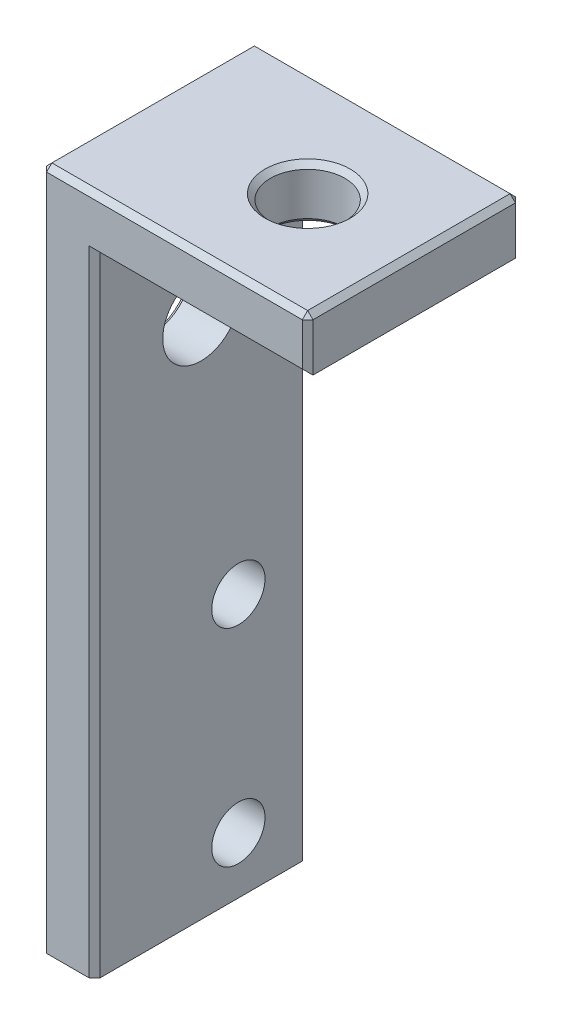
ISO-10303-21;
HEADER;
FILE_DESCRIPTION(('STEP AP214'),'2;1');
FILE_NAME('part.step','',(''),(''),'','','');
FILE_SCHEMA(('AUTOMOTIVE_DESIGN { 1 0 10303 214 1 1 1 1 }'));
ENDSEC;
DATA;
#1=APPLICATION_CONTEXT('core data for automotive mechanical design processes');
#2=APPLICATION_PROTOCOL_DEFINITION('international standard','automotive_design',2000,#1);
#3=PRODUCT_CONTEXT('',#1,'mechanical');
#4=PRODUCT('Part','Part','',(#3));
#5=PRODUCT_RELATED_PRODUCT_CATEGORY('part','',(#4));
#6=PRODUCT_DEFINITION_FORMATION('','',#4);
#7=PRODUCT_DEFINITION_CONTEXT('part definition',#1,'design');
#8=PRODUCT_DEFINITION('design','',#6,#7);
#9=PRODUCT_DEFINITION_SHAPE('','',#8);
#10=(LENGTH_UNIT() NAMED_UNIT(*) SI_UNIT(.MILLI.,.METRE.));
#11=(NAMED_UNIT(*) PLANE_ANGLE_UNIT() SI_UNIT($,.RADIAN.));
#12=(NAMED_UNIT(*) SI_UNIT($,.STERADIAN.) SOLID_ANGLE_UNIT());
#13=UNCERTAINTY_MEASURE_WITH_UNIT(LENGTH_MEASURE(1.E-05),#10,'distance_accuracy_value','');
#14=(GEOMETRIC_REPRESENTATION_CONTEXT(3) GLOBAL_UNCERTAINTY_ASSIGNED_CONTEXT((#13)) GLOBAL_UNIT_ASSIGNED_CONTEXT((#10,
#11,#12)) REPRESENTATION_CONTEXT('',''));
#15=CARTESIAN_POINT('',(0.,0.,0.));
#16=DIRECTION('',(0.,0.,1.));
#17=DIRECTION('',(1.,0.,0.));
#18=AXIS2_PLACEMENT_3D('',#15,#16,#17);
#19=CARTESIAN_POINT('',(2.5,34.,10.));
#20=DIRECTION('',(-1.,0.,0.));
#21=DIRECTION('',(0.,-1.,0.));
#22=AXIS2_PLACEMENT_3D('',#19,#20,#21);
#23=PLANE('',#22);
#24=CARTESIAN_POINT('',(2.5,7.15,3.25));
#25=DIRECTION('',(1.,0.,0.));
#26=DIRECTION('',(0.,1.,0.));
#27=AXIS2_PLACEMENT_3D('',#24,#25,#26);
#28=CIRCLE('',#27,1.25);
#29=CARTESIAN_POINT('',(2.5,8.4,3.25));
#30=VERTEX_POINT('',#29);
#31=EDGE_CURVE('E314',#30,#30,#28,.T.);
#32=ORIENTED_EDGE('',*,*,#31,.F.);
#33=EDGE_LOOP('',(#32));
#34=FACE_BOUND('',#33,.T.);
#35=CARTESIAN_POINT('',(2.5,16.85,3.25));
#36=DIRECTION('',(1.,0.,0.));
#37=DIRECTION('',(0.,-1.,0.));
#38=AXIS2_PLACEMENT_3D('',#35,#36,#37);
#39=CIRCLE('',#38,1.25);
#40=CARTESIAN_POINT('',(2.5,15.6,3.25));
#41=VERTEX_POINT('',#40);
#42=EDGE_CURVE('E308',#41,#41,#39,.T.);
#43=ORIENTED_EDGE('',*,*,#42,.F.);
#44=EDGE_LOOP('',(#43));
#45=FACE_BOUND('',#44,.T.);
#46=CARTESIAN_POINT('',(2.5,29.,5.));
#47=DIRECTION('',(1.,0.,0.));
#48=DIRECTION('',(0.,1.,0.));
#49=AXIS2_PLACEMENT_3D('',#46,#47,#48);
#50=CIRCLE('',#49,1.8);
#51=CARTESIAN_POINT('',(2.5,30.8,5.));
#52=VERTEX_POINT('',#51);
#53=EDGE_CURVE('E302',#52,#52,#50,.T.);
#54=ORIENTED_EDGE('',*,*,#53,.F.);
#55=EDGE_LOOP('',(#54));
#56=FACE_BOUND('',#55,.T.);
#57=DIRECTION('',(0.,-1.,0.));
#58=VECTOR('',#57,1.);
#59=CARTESIAN_POINT('',(2.5,34.,9.75));
#60=LINE('',#59,#58);
#61=CARTESIAN_POINT('',(2.5,34.,9.75));
#62=VERTEX_POINT('',#61);
#63=CARTESIAN_POINT('',(2.5,4.5,9.75));
#64=VERTEX_POINT('',#63);
#65=EDGE_CURVE('E174',#62,#64,#60,.T.);
#66=ORIENTED_EDGE('',*,*,#65,.T.);
#67=DIRECTION('',(0.,0.,1.));
#68=VECTOR('',#67,1.);
#69=CARTESIAN_POINT('',(2.5,4.5,0.));
#70=LINE('',#69,#68);
#71=CARTESIAN_POINT('',(2.5,4.5,0.249999999999999));
#72=VERTEX_POINT('',#71);
#73=EDGE_CURVE('E162',#72,#64,#70,.T.);
#74=ORIENTED_EDGE('',*,*,#73,.F.);
#75=DIRECTION('',(0.,1.,0.));
#76=VECTOR('',#75,1.);
#77=CARTESIAN_POINT('',(2.5,34.,0.25));
#78=LINE('',#77,#76);
#79=CARTESIAN_POINT('',(2.5,34.,0.25));
#80=VERTEX_POINT('',#79);
#81=EDGE_CURVE('E169',#72,#80,#78,.T.);
#82=ORIENTED_EDGE('',*,*,#81,.T.);
#83=DIRECTION('',(0.,0.,-1.));
#84=VECTOR('',#83,1.);
#85=CARTESIAN_POINT('',(2.5,34.,10.));
#86=LINE('',#85,#84);
#87=EDGE_CURVE('E322',#62,#80,#86,.T.);
#88=ORIENTED_EDGE('',*,*,#87,.F.);
#89=EDGE_LOOP('',(#66,#74,#82,#88));
#90=FACE_BOUND('',#89,.T.);
#91=ADVANCED_FACE('F41',(#34,#45,#56,#90),#23,.F.);
#92=CARTESIAN_POINT('',(12.5,34.,10.));
#93=DIRECTION('',(0.,1.,0.));
#94=DIRECTION('',(0.,0.,1.));
#95=AXIS2_PLACEMENT_3D('',#92,#93,#94);
#96=PLANE('',#95);
#97=CARTESIAN_POINT('',(7.5,34.,5.));
#98=DIRECTION('',(0.,1.,0.));
#99=DIRECTION('',(0.,0.,1.));
#100=AXIS2_PLACEMENT_3D('',#97,#98,#99);
#101=CIRCLE('',#100,2.00000000000001);
#102=CARTESIAN_POINT('',(7.5,34.,7.00000000000001));
#103=VERTEX_POINT('',#102);
#104=EDGE_CURVE('E197',#103,#103,#101,.T.);
#105=ORIENTED_EDGE('',*,*,#104,.T.);
#106=EDGE_LOOP('',(#105));
#107=FACE_BOUND('',#106,.T.);
#108=DIRECTION('',(0.,0.,-1.));
#109=VECTOR('',#108,1.);
#110=CARTESIAN_POINT('',(12.5,34.,10.));
#111=LINE('',#110,#109);
#112=CARTESIAN_POINT('',(12.5,34.,9.75));
#113=VERTEX_POINT('',#112);
#114=CARTESIAN_POINT('',(12.5,34.,0.25));
#115=VERTEX_POINT('',#114);
#116=EDGE_CURVE('E318',#113,#115,#111,.T.);
#117=ORIENTED_EDGE('',*,*,#116,.F.);
#118=DIRECTION('',(-1.,0.,0.));
#119=VECTOR('',#118,1.);
#120=CARTESIAN_POINT('',(12.5,34.,9.75));
#121=LINE('',#120,#119);
#122=EDGE_CURVE('E204',#113,#62,#121,.T.);
#123=ORIENTED_EDGE('',*,*,#122,.T.);
#124=ORIENTED_EDGE('',*,*,#87,.T.);
#125=DIRECTION('',(1.,0.,0.));
#126=VECTOR('',#125,1.);
#127=CARTESIAN_POINT('',(12.5,34.,0.25));
#128=LINE('',#127,#126);
#129=EDGE_CURVE('E201',#80,#115,#128,.T.);
#130=ORIENTED_EDGE('',*,*,#129,.T.);
#131=EDGE_LOOP('',(#117,#123,#124,#130));
#132=FACE_BOUND('',#131,.T.);
#133=ADVANCED_FACE('F433',(#107,#132),#96,.F.);
#134=CARTESIAN_POINT('',(12.5,36.5,10.));
#135=DIRECTION('',(-1.,0.,0.));
#136=DIRECTION('',(0.,-1.,0.));
#137=AXIS2_PLACEMENT_3D('',#134,#135,#136);
#138=PLANE('',#137);
#139=DIRECTION('',(0.,0.,1.));
#140=VECTOR('',#139,1.);
#141=CARTESIAN_POINT('',(12.5,36.25,10.));
#142=LINE('',#141,#140);
#143=CARTESIAN_POINT('',(12.5,36.25,0.25));
#144=VERTEX_POINT('',#143);
#145=CARTESIAN_POINT('',(12.5,36.25,9.75));
#146=VERTEX_POINT('',#145);
#147=EDGE_CURVE('E210',#144,#146,#142,.T.);
#148=ORIENTED_EDGE('',*,*,#147,.T.);
#149=DIRECTION('',(0.,-1.,0.));
#150=VECTOR('',#149,1.);
#151=CARTESIAN_POINT('',(12.5,36.5,9.75));
#152=LINE('',#151,#150);
#153=EDGE_CURVE('E213',#146,#113,#152,.T.);
#154=ORIENTED_EDGE('',*,*,#153,.T.);
#155=ORIENTED_EDGE('',*,*,#116,.T.);
#156=DIRECTION('',(0.,1.,0.));
#157=VECTOR('',#156,1.);
#158=CARTESIAN_POINT('',(12.5,36.5,0.25));
#159=LINE('',#158,#157);
#160=EDGE_CURVE('E207',#115,#144,#159,.T.);
#161=ORIENTED_EDGE('',*,*,#160,.T.);
#162=EDGE_LOOP('',(#148,#154,#155,#161));
#163=FACE_BOUND('',#162,.T.);
#164=ADVANCED_FACE('F436',(#163),#138,.F.);
#165=CARTESIAN_POINT('',(0.,36.5,10.));
#166=DIRECTION('',(0.,-1.,0.));
#167=DIRECTION('',(0.,0.,-1.));
#168=AXIS2_PLACEMENT_3D('',#165,#166,#167);
#169=PLANE('',#168);
#170=CARTESIAN_POINT('',(7.5,36.5,5.));
#171=DIRECTION('',(0.,-1.,0.));
#172=DIRECTION('',(0.,0.,-1.));
#173=AXIS2_PLACEMENT_3D('',#170,#171,#172);
#174=CIRCLE('',#173,2.);
#175=CARTESIAN_POINT('',(7.5,36.5,3.));
#176=VERTEX_POINT('',#175);
#177=EDGE_CURVE('E339',#176,#176,#174,.T.);
#178=ORIENTED_EDGE('',*,*,#177,.T.);
#179=EDGE_LOOP('',(#178));
#180=FACE_BOUND('',#179,.T.);
#181=DIRECTION('',(1.,0.,0.));
#182=VECTOR('',#181,1.);
#183=CARTESIAN_POINT('',(0.,36.5,9.75));
#184=LINE('',#183,#182);
#185=CARTESIAN_POINT('',(0.249999999999996,36.5,9.75));
#186=VERTEX_POINT('',#185);
#187=CARTESIAN_POINT('',(12.25,36.5,9.75));
#188=VERTEX_POINT('',#187);
#189=EDGE_CURVE('E332',#186,#188,#184,.T.);
#190=ORIENTED_EDGE('',*,*,#189,.T.);
#191=DIRECTION('',(0.,0.,-1.));
#192=VECTOR('',#191,1.);
#193=CARTESIAN_POINT('',(12.25,36.5,10.));
#194=LINE('',#193,#192);
#195=CARTESIAN_POINT('',(12.25,36.5,0.25));
#196=VERTEX_POINT('',#195);
#197=EDGE_CURVE('E335',#188,#196,#194,.T.);
#198=ORIENTED_EDGE('',*,*,#197,.T.);
#199=DIRECTION('',(-1.,0.,0.));
#200=VECTOR('',#199,1.);
#201=CARTESIAN_POINT('',(0.,36.5,0.25));
#202=LINE('',#201,#200);
#203=CARTESIAN_POINT('',(0.249999999999996,36.5,0.25));
#204=VERTEX_POINT('',#203);
#205=EDGE_CURVE('E326',#196,#204,#202,.T.);
#206=ORIENTED_EDGE('',*,*,#205,.T.);
#207=DIRECTION('',(0.,0.,1.));
#208=VECTOR('',#207,1.);
#209=CARTESIAN_POINT('',(0.249999999999996,36.5,10.));
#210=LINE('',#209,#208);
#211=EDGE_CURVE('E329',#204,#186,#210,.T.);
#212=ORIENTED_EDGE('',*,*,#211,.T.);
#213=EDGE_LOOP('',(#190,#198,#206,#212));
#214=FACE_BOUND('',#213,.T.);
#215=ADVANCED_FACE('F450',(#180,#214),#169,.F.);
#216=CARTESIAN_POINT('',(0.,0.,10.));
#217=DIRECTION('',(1.,0.,0.));
#218=DIRECTION('',(0.,1.,0.));
#219=AXIS2_PLACEMENT_3D('',#216,#217,#218);
#220=PLANE('',#219);
#221=DIRECTION('',(0.,-1.,0.));
#222=VECTOR('',#221,1.);
#223=CARTESIAN_POINT('',(0.,0.,0.25));
#224=LINE('',#223,#222);
#225=CARTESIAN_POINT('',(0.,36.25,0.25));
#226=VERTEX_POINT('',#225);
#227=CARTESIAN_POINT('',(0.,4.5,0.25));
#228=VERTEX_POINT('',#227);
#229=EDGE_CURVE('E160',#226,#228,#224,.T.);
#230=ORIENTED_EDGE('',*,*,#229,.T.);
#231=DIRECTION('',(0.,0.,1.));
#232=VECTOR('',#231,1.);
#233=CARTESIAN_POINT('',(0.,4.5,0.));
#234=LINE('',#233,#232);
#235=CARTESIAN_POINT('',(0.,4.5,9.75));
#236=VERTEX_POINT('',#235);
#237=EDGE_CURVE('E57',#228,#236,#234,.T.);
#238=ORIENTED_EDGE('',*,*,#237,.T.);
#239=DIRECTION('',(0.,1.,0.));
#240=VECTOR('',#239,1.);
#241=CARTESIAN_POINT('',(0.,0.,9.75));
#242=LINE('',#241,#240);
#243=CARTESIAN_POINT('',(0.,36.25,9.75));
#244=VERTEX_POINT('',#243);
#245=EDGE_CURVE('E157',#236,#244,#242,.T.);
#246=ORIENTED_EDGE('',*,*,#245,.T.);
#247=DIRECTION('',(0.,0.,-1.));
#248=VECTOR('',#247,1.);
#249=CARTESIAN_POINT('',(0.,36.25,10.));
#250=LINE('',#249,#248);
#251=EDGE_CURVE('E170',#244,#226,#250,.T.);
#252=ORIENTED_EDGE('',*,*,#251,.T.);
#253=EDGE_LOOP('',(#230,#238,#246,#252));
#254=FACE_BOUND('',#253,.T.);
#255=CARTESIAN_POINT('',(0.,29.,5.));
#256=DIRECTION('',(1.,0.,0.));
#257=DIRECTION('',(0.,1.,0.));
#258=AXIS2_PLACEMENT_3D('',#255,#256,#257);
#259=CIRCLE('',#258,2.04999999999999);
#260=CARTESIAN_POINT('',(0.,31.05,5.));
#261=VERTEX_POINT('',#260);
#262=EDGE_CURVE('E359',#261,#261,#259,.T.);
#263=ORIENTED_EDGE('',*,*,#262,.T.);
#264=EDGE_LOOP('',(#263));
#265=FACE_BOUND('',#264,.T.);
#266=CARTESIAN_POINT('',(0.,7.15,3.25));
#267=DIRECTION('',(1.,0.,0.));
#268=DIRECTION('',(0.,1.,0.));
#269=AXIS2_PLACEMENT_3D('',#266,#267,#268);
#270=CIRCLE('',#269,1.49999999999999);
#271=CARTESIAN_POINT('',(0.,8.65,3.25));
#272=VERTEX_POINT('',#271);
#273=EDGE_CURVE('E355',#272,#272,#270,.T.);
#274=ORIENTED_EDGE('',*,*,#273,.T.);
#275=EDGE_LOOP('',(#274));
#276=FACE_BOUND('',#275,.T.);
#277=CARTESIAN_POINT('',(0.,16.85,3.25));
#278=DIRECTION('',(1.,0.,0.));
#279=DIRECTION('',(0.,1.,0.));
#280=AXIS2_PLACEMENT_3D('',#277,#278,#279);
#281=CIRCLE('',#280,1.50000000000001);
#282=CARTESIAN_POINT('',(0.,18.35,3.25));
#283=VERTEX_POINT('',#282);
#284=EDGE_CURVE('E351',#283,#283,#281,.T.);
#285=ORIENTED_EDGE('',*,*,#284,.T.);
#286=EDGE_LOOP('',(#285));
#287=FACE_BOUND('',#286,.T.);
#288=ADVANCED_FACE('F155',(#254,#265,#276,#287),#220,.F.);
#289=CARTESIAN_POINT('',(0.,0.,10.));
#290=DIRECTION('',(0.,0.,-1.));
#291=DIRECTION('',(-1.,0.,0.));
#292=AXIS2_PLACEMENT_3D('',#289,#290,#291);
#293=PLANE('',#292);
#294=DIRECTION('',(0.,-1.,0.));
#295=VECTOR('',#294,1.);
#296=CARTESIAN_POINT('',(0.25,0.,10.));
#297=LINE('',#296,#295);
#298=CARTESIAN_POINT('',(0.249999999999996,36.25,10.));
#299=VERTEX_POINT('',#298);
#300=CARTESIAN_POINT('',(0.25,4.5,10.));
#301=VERTEX_POINT('',#300);
#302=EDGE_CURVE('E194',#299,#301,#297,.T.);
#303=ORIENTED_EDGE('',*,*,#302,.T.);
#304=DIRECTION('',(1.,0.,0.));
#305=VECTOR('',#304,1.);
#306=CARTESIAN_POINT('',(0.,4.5,10.));
#307=LINE('',#306,#305);
#308=CARTESIAN_POINT('',(2.25,4.5,10.));
#309=VERTEX_POINT('',#308);
#310=EDGE_CURVE('E145',#301,#309,#307,.T.);
#311=ORIENTED_EDGE('',*,*,#310,.T.);
#312=DIRECTION('',(0.,1.,0.));
#313=VECTOR('',#312,1.);
#314=CARTESIAN_POINT('',(2.25,0.,10.));
#315=LINE('',#314,#313);
#316=CARTESIAN_POINT('',(2.25,34.25,10.));
#317=VERTEX_POINT('',#316);
#318=EDGE_CURVE('E191',#309,#317,#315,.T.);
#319=ORIENTED_EDGE('',*,*,#318,.T.);
#320=DIRECTION('',(1.,0.,0.));
#321=VECTOR('',#320,1.);
#322=CARTESIAN_POINT('',(0.,34.25,10.));
#323=LINE('',#322,#321);
#324=CARTESIAN_POINT('',(12.25,34.25,10.));
#325=VERTEX_POINT('',#324);
#326=EDGE_CURVE('E188',#317,#325,#323,.T.);
#327=ORIENTED_EDGE('',*,*,#326,.T.);
#328=DIRECTION('',(0.,1.,0.));
#329=VECTOR('',#328,1.);
#330=CARTESIAN_POINT('',(12.25,0.,10.));
#331=LINE('',#330,#329);
#332=CARTESIAN_POINT('',(12.25,36.25,10.));
#333=VERTEX_POINT('',#332);
#334=EDGE_CURVE('E185',#325,#333,#331,.T.);
#335=ORIENTED_EDGE('',*,*,#334,.T.);
#336=DIRECTION('',(-1.,0.,0.));
#337=VECTOR('',#336,1.);
#338=CARTESIAN_POINT('',(0.,36.25,10.));
#339=LINE('',#338,#337);
#340=EDGE_CURVE('E182',#333,#299,#339,.T.);
#341=ORIENTED_EDGE('',*,*,#340,.T.);
#342=EDGE_LOOP('',(#303,#311,#319,#327,#335,#341));
#343=FACE_BOUND('',#342,.T.);
#344=ADVANCED_FACE('F398',(#343),#293,.F.);
#345=CARTESIAN_POINT('',(0.,0.,0.));
#346=DIRECTION('',(0.,0.,-1.));
#347=DIRECTION('',(-1.,0.,0.));
#348=AXIS2_PLACEMENT_3D('',#345,#346,#347);
#349=PLANE('',#348);
#350=DIRECTION('',(1.,0.,0.));
#351=VECTOR('',#350,1.);
#352=CARTESIAN_POINT('',(0.,4.5,0.));
#353=LINE('',#352,#351);
#354=CARTESIAN_POINT('',(0.25,4.5,0.));
#355=VERTEX_POINT('',#354);
#356=CARTESIAN_POINT('',(2.25,4.5,0.));
#357=VERTEX_POINT('',#356);
#358=EDGE_CURVE('E151',#355,#357,#353,.T.);
#359=ORIENTED_EDGE('',*,*,#358,.F.);
#360=DIRECTION('',(0.,1.,0.));
#361=VECTOR('',#360,1.);
#362=CARTESIAN_POINT('',(0.249999999999996,36.5,0.));
#363=LINE('',#362,#361);
#364=CARTESIAN_POINT('',(0.249999999999996,36.25,0.));
#365=VERTEX_POINT('',#364);
#366=EDGE_CURVE('E216',#355,#365,#363,.T.);
#367=ORIENTED_EDGE('',*,*,#366,.T.);
#368=DIRECTION('',(1.,0.,0.));
#369=VECTOR('',#368,1.);
#370=CARTESIAN_POINT('',(12.5,36.25,0.));
#371=LINE('',#370,#369);
#372=CARTESIAN_POINT('',(12.25,36.25,0.));
#373=VERTEX_POINT('',#372);
#374=EDGE_CURVE('E219',#365,#373,#371,.T.);
#375=ORIENTED_EDGE('',*,*,#374,.T.);
#376=DIRECTION('',(0.,-1.,0.));
#377=VECTOR('',#376,1.);
#378=CARTESIAN_POINT('',(12.25,34.,0.));
#379=LINE('',#378,#377);
#380=CARTESIAN_POINT('',(12.25,34.25,0.));
#381=VERTEX_POINT('',#380);
#382=EDGE_CURVE('E222',#373,#381,#379,.T.);
#383=ORIENTED_EDGE('',*,*,#382,.T.);
#384=DIRECTION('',(-1.,0.,0.));
#385=VECTOR('',#384,1.);
#386=CARTESIAN_POINT('',(2.5,34.25,0.));
#387=LINE('',#386,#385);
#388=CARTESIAN_POINT('',(2.25,34.25,0.));
#389=VERTEX_POINT('',#388);
#390=EDGE_CURVE('E65',#381,#389,#387,.T.);
#391=ORIENTED_EDGE('',*,*,#390,.T.);
#392=DIRECTION('',(0.,-1.,0.));
#393=VECTOR('',#392,1.);
#394=CARTESIAN_POINT('',(2.25,0.,0.));
#395=LINE('',#394,#393);
#396=EDGE_CURVE('E227',#389,#357,#395,.T.);
#397=ORIENTED_EDGE('',*,*,#396,.T.);
#398=EDGE_LOOP('',(#359,#367,#375,#383,#391,#397));
#399=FACE_BOUND('',#398,.T.);
#400=ADVANCED_FACE('F424',(#399),#349,.T.);
#401=CARTESIAN_POINT('',(7.49999999999999,44.,5.));
#402=DIRECTION('',(0.,-1.,0.));
#403=DIRECTION('',(1.,0.,0.));
#404=AXIS2_PLACEMENT_3D('',#401,#402,#403);
#405=CYLINDRICAL_SURFACE('',#404,1.75);
#406=CARTESIAN_POINT('',(7.5,36.25,5.));
#407=DIRECTION('',(0.,-1.,0.));
#408=DIRECTION('',(0.,0.,-1.));
#409=AXIS2_PLACEMENT_3D('',#406,#407,#408);
#410=CIRCLE('',#409,1.75);
#411=CARTESIAN_POINT('',(7.5,36.25,3.25));
#412=VERTEX_POINT('',#411);
#413=EDGE_CURVE('E347',#412,#412,#410,.F.);
#414=ORIENTED_EDGE('',*,*,#413,.T.);
#415=EDGE_LOOP('',(#414));
#416=FACE_BOUND('',#415,.T.);
#417=CARTESIAN_POINT('',(7.5,34.25,5.));
#418=DIRECTION('',(0.,1.,0.));
#419=DIRECTION('',(0.,0.,1.));
#420=AXIS2_PLACEMENT_3D('',#417,#418,#419);
#421=CIRCLE('',#420,1.75);
#422=CARTESIAN_POINT('',(7.5,34.25,6.75));
#423=VERTEX_POINT('',#422);
#424=EDGE_CURVE('E343',#423,#423,#421,.F.);
#425=ORIENTED_EDGE('',*,*,#424,.T.);
#426=EDGE_LOOP('',(#425));
#427=FACE_BOUND('',#426,.T.);
#428=ADVANCED_FACE('F601',(#416,#427),#405,.F.);
#429=CARTESIAN_POINT('',(0.,29.,5.));
#430=DIRECTION('',(1.,0.,0.));
#431=DIRECTION('',(0.,1.,0.));
#432=AXIS2_PLACEMENT_3D('',#429,#430,#431);
#433=CYLINDRICAL_SURFACE('',#432,1.8);
#434=CARTESIAN_POINT('',(0.249999999999987,29.,5.));
#435=DIRECTION('',(1.,0.,0.));
#436=DIRECTION('',(0.,0.,-1.));
#437=AXIS2_PLACEMENT_3D('',#434,#435,#436);
#438=CIRCLE('',#437,1.8);
#439=CARTESIAN_POINT('',(0.249999999999987,29.,3.20000000000001));
#440=VERTEX_POINT('',#439);
#441=EDGE_CURVE('E230',#440,#440,#438,.F.);
#442=ORIENTED_EDGE('',*,*,#441,.T.);
#443=EDGE_LOOP('',(#442));
#444=FACE_BOUND('',#443,.T.);
#445=ORIENTED_EDGE('',*,*,#53,.T.);
#446=EDGE_LOOP('',(#445));
#447=FACE_BOUND('',#446,.T.);
#448=ADVANCED_FACE('F606',(#444,#447),#433,.F.);
#449=CARTESIAN_POINT('',(0.,16.85,3.25));
#450=DIRECTION('',(1.,0.,0.));
#451=DIRECTION('',(0.,1.,0.));
#452=AXIS2_PLACEMENT_3D('',#449,#450,#451);
#453=CYLINDRICAL_SURFACE('',#452,1.25);
#454=CARTESIAN_POINT('',(0.250000000000011,16.85,3.25));
#455=DIRECTION('',(1.,0.,0.));
#456=DIRECTION('',(0.,0.,-1.));
#457=AXIS2_PLACEMENT_3D('',#454,#455,#456);
#458=CIRCLE('',#457,1.25);
#459=CARTESIAN_POINT('',(0.250000000000011,16.85,2.));
#460=VERTEX_POINT('',#459);
#461=EDGE_CURVE('E51',#460,#460,#458,.F.);
#462=ORIENTED_EDGE('',*,*,#461,.T.);
#463=EDGE_LOOP('',(#462));
#464=FACE_BOUND('',#463,.T.);
#465=ORIENTED_EDGE('',*,*,#42,.T.);
#466=EDGE_LOOP('',(#465));
#467=FACE_BOUND('',#466,.T.);
#468=ADVANCED_FACE('F618',(#464,#467),#453,.F.);
#469=CARTESIAN_POINT('',(0.,7.15,3.25));
#470=DIRECTION('',(1.,0.,0.));
#471=DIRECTION('',(0.,1.,0.));
#472=AXIS2_PLACEMENT_3D('',#469,#470,#471);
#473=CYLINDRICAL_SURFACE('',#472,1.25);
#474=CARTESIAN_POINT('',(0.249999999999994,7.15,3.25));
#475=DIRECTION('',(1.,0.,0.));
#476=DIRECTION('',(0.,0.,-1.));
#477=AXIS2_PLACEMENT_3D('',#474,#475,#476);
#478=CIRCLE('',#477,1.25);
#479=CARTESIAN_POINT('',(0.249999999999994,7.15,2.));
#480=VERTEX_POINT('',#479);
#481=EDGE_CURVE('E234',#480,#480,#478,.F.);
#482=ORIENTED_EDGE('',*,*,#481,.T.);
#483=EDGE_LOOP('',(#482));
#484=FACE_BOUND('',#483,.T.);
#485=ORIENTED_EDGE('',*,*,#31,.T.);
#486=EDGE_LOOP('',(#485));
#487=FACE_BOUND('',#486,.T.);
#488=ADVANCED_FACE('F480',(#484,#487),#473,.F.);
#489=CARTESIAN_POINT('',(7.5,36.5,5.));
#490=DIRECTION('',(0.,1.,0.));
#491=DIRECTION('',(0.,0.,1.));
#492=AXIS2_PLACEMENT_3D('',#489,#490,#491);
#493=CONICAL_SURFACE('',#492,2.,0.785398163397441);
#494=ORIENTED_EDGE('',*,*,#413,.F.);
#495=EDGE_LOOP('',(#494));
#496=FACE_BOUND('',#495,.T.);
#497=ORIENTED_EDGE('',*,*,#177,.F.);
#498=EDGE_LOOP('',(#497));
#499=FACE_BOUND('',#498,.T.);
#500=ADVANCED_FACE('F474',(#496,#499),#493,.F.);
#501=CARTESIAN_POINT('',(12.25,0.,10.));
#502=DIRECTION('',(-0.707106781186549,0.,-0.707106781186547));
#503=DIRECTION('',(0.,1.,0.));
#504=AXIS2_PLACEMENT_3D('',#501,#502,#503);
#505=PLANE('',#504);
#506=DIRECTION('',(0.577350269189625,-0.577350269189626,-0.577350269189626));
#507=VECTOR('',#506,1.);
#508=CARTESIAN_POINT('',(23.6666666666667,22.8333333333333,-1.41666666666669));
#509=LINE('',#508,#507);
#510=EDGE_CURVE('E292',#113,#325,#509,.F.);
#511=ORIENTED_EDGE('',*,*,#510,.F.);
#512=ORIENTED_EDGE('',*,*,#153,.F.);
#513=DIRECTION('',(-0.707106781186546,0.,0.707106781186548));
#514=VECTOR('',#513,1.);
#515=CARTESIAN_POINT('',(12.25,36.25,10.));
#516=LINE('',#515,#514);
#517=EDGE_CURVE('E296',#333,#146,#516,.F.);
#518=ORIENTED_EDGE('',*,*,#517,.F.);
#519=ORIENTED_EDGE('',*,*,#334,.F.);
#520=EDGE_LOOP('',(#511,#512,#518,#519));
#521=FACE_BOUND('',#520,.T.);
#522=ADVANCED_FACE('F401',(#521),#505,.F.);
#523=CARTESIAN_POINT('',(12.5,36.5,0.25));
#524=DIRECTION('',(0.707106781186549,0.,-0.707106781186547));
#525=DIRECTION('',(0.,-1.,0.));
#526=AXIS2_PLACEMENT_3D('',#523,#524,#525);
#527=PLANE('',#526);
#528=DIRECTION('',(-0.707106781186546,0.,-0.707106781186548));
#529=VECTOR('',#528,1.);
#530=CARTESIAN_POINT('',(12.375,36.25,0.125));
#531=LINE('',#530,#529);
#532=EDGE_CURVE('E284',#144,#373,#531,.T.);
#533=ORIENTED_EDGE('',*,*,#532,.F.);
#534=ORIENTED_EDGE('',*,*,#160,.F.);
#535=DIRECTION('',(-0.577350269189625,0.577350269189626,-0.577350269189626));
#536=VECTOR('',#535,1.);
#537=CARTESIAN_POINT('',(11.6666666666667,34.8333333333333,-0.583333333333336));
#538=LINE('',#537,#536);
#539=EDGE_CURVE('E288',#381,#115,#538,.F.);
#540=ORIENTED_EDGE('',*,*,#539,.F.);
#541=ORIENTED_EDGE('',*,*,#382,.F.);
#542=EDGE_LOOP('',(#533,#534,#540,#541));
#543=FACE_BOUND('',#542,.T.);
#544=ADVANCED_FACE('F440',(#543),#527,.T.);
#545=CARTESIAN_POINT('',(12.25,36.5,10.));
#546=DIRECTION('',(-0.707106781186547,-0.707106781186547,0.));
#547=DIRECTION('',(0.,0.,-1.));
#548=AXIS2_PLACEMENT_3D('',#545,#546,#547);
#549=PLANE('',#548);
#550=DIRECTION('',(0.707106781186547,-0.707106781186547,0.));
#551=VECTOR('',#550,1.);
#552=CARTESIAN_POINT('',(12.375,36.375,9.75));
#553=LINE('',#552,#551);
#554=EDGE_CURVE('E299',#146,#188,#553,.F.);
#555=ORIENTED_EDGE('',*,*,#554,.F.);
#556=ORIENTED_EDGE('',*,*,#147,.F.);
#557=DIRECTION('',(-0.707106781186547,0.707106781186547,0.));
#558=VECTOR('',#557,1.);
#559=CARTESIAN_POINT('',(12.25,36.5,0.25));
#560=LINE('',#559,#558);
#561=EDGE_CURVE('E280',#196,#144,#560,.F.);
#562=ORIENTED_EDGE('',*,*,#561,.F.);
#563=ORIENTED_EDGE('',*,*,#197,.F.);
#564=EDGE_LOOP('',(#555,#556,#562,#563));
#565=FACE_BOUND('',#564,.T.);
#566=ADVANCED_FACE('F448',(#565),#549,.F.);
#567=CARTESIAN_POINT('',(12.25,36.25,10.));
#568=DIRECTION('',(0.577350269189626,0.577350269189626,0.577350269189626));
#569=DIRECTION('',(0.707106781186547,0.,-0.707106781186547));
#570=AXIS2_PLACEMENT_3D('',#567,#568,#569);
#571=PLANE('',#570);
#572=ORIENTED_EDGE('',*,*,#517,.T.);
#573=ORIENTED_EDGE('',*,*,#554,.T.);
#574=DIRECTION('',(0.,0.707106781186547,-0.707106781186547));
#575=VECTOR('',#574,1.);
#576=CARTESIAN_POINT('',(12.25,36.25,10.));
#577=LINE('',#576,#575);
#578=EDGE_CURVE('E276',#333,#188,#577,.T.);
#579=ORIENTED_EDGE('',*,*,#578,.F.);
#580=EDGE_LOOP('',(#572,#573,#579));
#581=FACE_BOUND('',#580,.T.);
#582=ADVANCED_FACE('F404',(#581),#571,.T.);
#583=CARTESIAN_POINT('',(0.,34.25,10.));
#584=DIRECTION('',(0.,0.707106781186547,-0.707106781186547));
#585=DIRECTION('',(1.,0.,0.));
#586=AXIS2_PLACEMENT_3D('',#583,#584,#585);
#587=PLANE('',#586);
#588=ORIENTED_EDGE('',*,*,#510,.T.);
#589=ORIENTED_EDGE('',*,*,#326,.F.);
#590=DIRECTION('',(0.577350269189626,-0.577350269189626,-0.577350269189626));
#591=VECTOR('',#590,1.);
#592=CARTESIAN_POINT('',(13.6666666666667,22.8333333333333,-1.41666666666667));
#593=LINE('',#592,#591);
#594=EDGE_CURVE('E272',#62,#317,#593,.F.);
#595=ORIENTED_EDGE('',*,*,#594,.F.);
#596=ORIENTED_EDGE('',*,*,#122,.F.);
#597=EDGE_LOOP('',(#588,#589,#595,#596));
#598=FACE_BOUND('',#597,.T.);
#599=ADVANCED_FACE('F394',(#598),#587,.F.);
#600=CARTESIAN_POINT('',(12.5,34.,0.25));
#601=DIRECTION('',(0.,-0.707106781186547,-0.707106781186547));
#602=DIRECTION('',(-1.,0.,0.));
#603=AXIS2_PLACEMENT_3D('',#600,#601,#602);
#604=PLANE('',#603);
#605=ORIENTED_EDGE('',*,*,#539,.T.);
#606=ORIENTED_EDGE('',*,*,#129,.F.);
#607=DIRECTION('',(-0.577350269189626,0.577350269189626,-0.577350269189626));
#608=VECTOR('',#607,1.);
#609=CARTESIAN_POINT('',(2.5,34.,0.25));
#610=LINE('',#609,#608);
#611=EDGE_CURVE('E268',#389,#80,#610,.F.);
#612=ORIENTED_EDGE('',*,*,#611,.F.);
#613=ORIENTED_EDGE('',*,*,#390,.F.);
#614=EDGE_LOOP('',(#605,#606,#612,#613));
#615=FACE_BOUND('',#614,.T.);
#616=ADVANCED_FACE('F430',(#615),#604,.T.);
#617=CARTESIAN_POINT('',(12.25,36.5,0.25));
#618=DIRECTION('',(0.577350269189626,0.577350269189626,-0.577350269189626));
#619=DIRECTION('',(-0.707106781186547,0.,-0.707106781186547));
#620=AXIS2_PLACEMENT_3D('',#617,#618,#619);
#621=PLANE('',#620);
#622=ORIENTED_EDGE('',*,*,#561,.T.);
#623=ORIENTED_EDGE('',*,*,#532,.T.);
#624=DIRECTION('',(0.,0.707106781186547,0.707106781186547));
#625=VECTOR('',#624,1.);
#626=CARTESIAN_POINT('',(12.25,36.5,0.25));
#627=LINE('',#626,#625);
#628=EDGE_CURVE('E264',#196,#373,#627,.F.);
#629=ORIENTED_EDGE('',*,*,#628,.F.);
#630=EDGE_LOOP('',(#622,#623,#629));
#631=FACE_BOUND('',#630,.T.);
#632=ADVANCED_FACE('F445',(#631),#621,.T.);
#633=CARTESIAN_POINT('',(0.,36.25,10.));
#634=DIRECTION('',(0.,-0.707106781186547,-0.707106781186547));
#635=DIRECTION('',(-1.,0.,0.));
#636=AXIS2_PLACEMENT_3D('',#633,#634,#635);
#637=PLANE('',#636);
#638=ORIENTED_EDGE('',*,*,#578,.T.);
#639=ORIENTED_EDGE('',*,*,#189,.F.);
#640=DIRECTION('',(0.,-0.707106781186547,0.707106781186547));
#641=VECTOR('',#640,1.);
#642=CARTESIAN_POINT('',(0.249999999999996,36.375,9.875));
#643=LINE('',#642,#641);
#644=EDGE_CURVE('E256',#299,#186,#643,.F.);
#645=ORIENTED_EDGE('',*,*,#644,.F.);
#646=ORIENTED_EDGE('',*,*,#340,.F.);
#647=EDGE_LOOP('',(#638,#639,#645,#646));
#648=FACE_BOUND('',#647,.T.);
#649=ADVANCED_FACE('F408',(#648),#637,.F.);
#650=CARTESIAN_POINT('',(2.25,0.,10.));
#651=DIRECTION('',(-0.707106781186547,0.,-0.707106781186547));
#652=DIRECTION('',(0.,1.,0.));
#653=AXIS2_PLACEMENT_3D('',#650,#651,#652);
#654=PLANE('',#653);
#655=DIRECTION('',(0.707106781186548,0.,-0.707106781186548));
#656=VECTOR('',#655,1.);
#657=CARTESIAN_POINT('',(2.25,4.5,10.));
#658=LINE('',#657,#656);
#659=EDGE_CURVE('E370',#64,#309,#658,.F.);
#660=ORIENTED_EDGE('',*,*,#659,.F.);
#661=ORIENTED_EDGE('',*,*,#65,.F.);
#662=ORIENTED_EDGE('',*,*,#594,.T.);
#663=ORIENTED_EDGE('',*,*,#318,.F.);
#664=EDGE_LOOP('',(#660,#661,#662,#663));
#665=FACE_BOUND('',#664,.T.);
#666=ADVANCED_FACE('F386',(#665),#654,.F.);
#667=CARTESIAN_POINT('',(2.5,34.,0.25));
#668=DIRECTION('',(0.707106781186547,0.,-0.707106781186547));
#669=DIRECTION('',(0.,-1.,0.));
#670=AXIS2_PLACEMENT_3D('',#667,#668,#669);
#671=PLANE('',#670);
#672=DIRECTION('',(0.707106781186548,0.,0.707106781186548));
#673=VECTOR('',#672,1.);
#674=CARTESIAN_POINT('',(2.5,4.5,0.249999999999998));
#675=LINE('',#674,#673);
#676=EDGE_CURVE('E245',#357,#72,#675,.T.);
#677=ORIENTED_EDGE('',*,*,#676,.F.);
#678=ORIENTED_EDGE('',*,*,#396,.F.);
#679=ORIENTED_EDGE('',*,*,#611,.T.);
#680=ORIENTED_EDGE('',*,*,#81,.F.);
#681=EDGE_LOOP('',(#677,#678,#679,#680));
#682=FACE_BOUND('',#681,.T.);
#683=ADVANCED_FACE('F428',(#682),#671,.T.);
#684=CARTESIAN_POINT('',(0.,36.5,0.25));
#685=DIRECTION('',(0.,0.707106781186547,-0.707106781186547));
#686=DIRECTION('',(1.,0.,0.));
#687=AXIS2_PLACEMENT_3D('',#684,#685,#686);
#688=PLANE('',#687);
#689=ORIENTED_EDGE('',*,*,#628,.T.);
#690=ORIENTED_EDGE('',*,*,#374,.F.);
#691=DIRECTION('',(0.,-0.707106781186547,-0.707106781186547));
#692=VECTOR('',#691,1.);
#693=CARTESIAN_POINT('',(0.249999999999996,36.375,0.125));
#694=LINE('',#693,#692);
#695=EDGE_CURVE('E252',#204,#365,#694,.T.);
#696=ORIENTED_EDGE('',*,*,#695,.F.);
#697=ORIENTED_EDGE('',*,*,#205,.F.);
#698=EDGE_LOOP('',(#689,#690,#696,#697));
#699=FACE_BOUND('',#698,.T.);
#700=ADVANCED_FACE('F452',(#699),#688,.T.);
#701=CARTESIAN_POINT('',(0.,36.25,10.));
#702=DIRECTION('',(0.707106781186547,-0.707106781186547,0.));
#703=DIRECTION('',(0.,0.,-1.));
#704=AXIS2_PLACEMENT_3D('',#701,#702,#703);
#705=PLANE('',#704);
#706=DIRECTION('',(0.707106781186547,0.707106781186547,0.));
#707=VECTOR('',#706,1.);
#708=CARTESIAN_POINT('',(0.,36.25,9.75));
#709=LINE('',#708,#707);
#710=EDGE_CURVE('E260',#186,#244,#709,.F.);
#711=ORIENTED_EDGE('',*,*,#710,.F.);
#712=ORIENTED_EDGE('',*,*,#211,.F.);
#713=DIRECTION('',(-0.707106781186547,-0.707106781186547,0.));
#714=VECTOR('',#713,1.);
#715=CARTESIAN_POINT('',(0.,36.25,0.25));
#716=LINE('',#715,#714);
#717=EDGE_CURVE('E248',#226,#204,#716,.F.);
#718=ORIENTED_EDGE('',*,*,#717,.F.);
#719=ORIENTED_EDGE('',*,*,#251,.F.);
#720=EDGE_LOOP('',(#711,#712,#718,#719));
#721=FACE_BOUND('',#720,.T.);
#722=ADVANCED_FACE('F414',(#721),#705,.F.);
#723=CARTESIAN_POINT('',(0.,36.25,9.75));
#724=DIRECTION('',(-0.577350269189626,0.577350269189626,0.577350269189626));
#725=DIRECTION('',(0.707106781186547,0.,0.707106781186547));
#726=AXIS2_PLACEMENT_3D('',#723,#724,#725);
#727=PLANE('',#726);
#728=ORIENTED_EDGE('',*,*,#644,.T.);
#729=ORIENTED_EDGE('',*,*,#710,.T.);
#730=DIRECTION('',(-0.707106781186548,0.,-0.707106781186548));
#731=VECTOR('',#730,1.);
#732=CARTESIAN_POINT('',(0.,36.25,9.75));
#733=LINE('',#732,#731);
#734=EDGE_CURVE('E167',#299,#244,#733,.T.);
#735=ORIENTED_EDGE('',*,*,#734,.F.);
#736=EDGE_LOOP('',(#728,#729,#735));
#737=FACE_BOUND('',#736,.T.);
#738=ADVANCED_FACE('F411',(#737),#727,.T.);
#739=CARTESIAN_POINT('',(0.,36.25,0.25));
#740=DIRECTION('',(-0.577350269189626,0.577350269189626,-0.577350269189626));
#741=DIRECTION('',(-0.707106781186547,0.,0.707106781186547));
#742=AXIS2_PLACEMENT_3D('',#739,#740,#741);
#743=PLANE('',#742);
#744=ORIENTED_EDGE('',*,*,#717,.T.);
#745=ORIENTED_EDGE('',*,*,#695,.T.);
#746=DIRECTION('',(-0.707106781186548,0.,0.707106781186548));
#747=VECTOR('',#746,1.);
#748=CARTESIAN_POINT('',(0.,36.25,0.25));
#749=LINE('',#748,#747);
#750=EDGE_CURVE('E241',#226,#365,#749,.F.);
#751=ORIENTED_EDGE('',*,*,#750,.F.);
#752=EDGE_LOOP('',(#744,#745,#751));
#753=FACE_BOUND('',#752,.T.);
#754=ADVANCED_FACE('F419',(#753),#743,.T.);
#755=CARTESIAN_POINT('',(0.25,0.,10.));
#756=DIRECTION('',(0.707106781186547,0.,-0.707106781186547));
#757=DIRECTION('',(0.,-1.,0.));
#758=AXIS2_PLACEMENT_3D('',#755,#756,#757);
#759=PLANE('',#758);
#760=DIRECTION('',(0.707106781186548,0.,0.707106781186548));
#761=VECTOR('',#760,1.);
#762=CARTESIAN_POINT('',(0.25,4.5,10.));
#763=LINE('',#762,#761);
#764=EDGE_CURVE('E142',#301,#236,#763,.F.);
#765=ORIENTED_EDGE('',*,*,#764,.F.);
#766=ORIENTED_EDGE('',*,*,#302,.F.);
#767=ORIENTED_EDGE('',*,*,#734,.T.);
#768=ORIENTED_EDGE('',*,*,#245,.F.);
#769=EDGE_LOOP('',(#765,#766,#767,#768));
#770=FACE_BOUND('',#769,.T.);
#771=ADVANCED_FACE('F165',(#770),#759,.F.);
#772=CARTESIAN_POINT('',(0.,0.,0.25));
#773=DIRECTION('',(-0.707106781186547,0.,-0.707106781186547));
#774=DIRECTION('',(0.,1.,0.));
#775=AXIS2_PLACEMENT_3D('',#772,#773,#774);
#776=PLANE('',#775);
#777=DIRECTION('',(0.707106781186548,0.,-0.707106781186548));
#778=VECTOR('',#777,1.);
#779=CARTESIAN_POINT('',(0.,4.5,0.250000000000001));
#780=LINE('',#779,#778);
#781=EDGE_CURVE('E11',#228,#355,#780,.T.);
#782=ORIENTED_EDGE('',*,*,#781,.F.);
#783=ORIENTED_EDGE('',*,*,#229,.F.);
#784=ORIENTED_EDGE('',*,*,#750,.T.);
#785=ORIENTED_EDGE('',*,*,#366,.F.);
#786=EDGE_LOOP('',(#782,#783,#784,#785));
#787=FACE_BOUND('',#786,.T.);
#788=ADVANCED_FACE('F422',(#787),#776,.T.);
#789=CARTESIAN_POINT('',(0.,29.,5.));
#790=DIRECTION('',(-1.,0.,0.));
#791=DIRECTION('',(0.,0.,1.));
#792=AXIS2_PLACEMENT_3D('',#789,#790,#791);
#793=CONICAL_SURFACE('',#792,2.04999999999999,0.785398163397447);
#794=ORIENTED_EDGE('',*,*,#441,.F.);
#795=EDGE_LOOP('',(#794));
#796=FACE_BOUND('',#795,.T.);
#797=ORIENTED_EDGE('',*,*,#262,.F.);
#798=EDGE_LOOP('',(#797));
#799=FACE_BOUND('',#798,.T.);
#800=ADVANCED_FACE('F489',(#796,#799),#793,.F.);
#801=CARTESIAN_POINT('',(7.5,34.25,5.));
#802=DIRECTION('',(0.,-1.,0.));
#803=DIRECTION('',(0.,0.,-1.));
#804=AXIS2_PLACEMENT_3D('',#801,#802,#803);
#805=CONICAL_SURFACE('',#804,1.75,0.785398163397436);
#806=ORIENTED_EDGE('',*,*,#104,.F.);
#807=EDGE_LOOP('',(#806));
#808=FACE_BOUND('',#807,.T.);
#809=ORIENTED_EDGE('',*,*,#424,.F.);
#810=EDGE_LOOP('',(#809));
#811=FACE_BOUND('',#810,.T.);
#812=ADVANCED_FACE('F553',(#808,#811),#805,.F.);
#813=CARTESIAN_POINT('',(0.,7.15,3.25));
#814=DIRECTION('',(-1.,0.,0.));
#815=DIRECTION('',(0.,0.,1.));
#816=AXIS2_PLACEMENT_3D('',#813,#814,#815);
#817=CONICAL_SURFACE('',#816,1.49999999999999,0.785398163397444);
#818=ORIENTED_EDGE('',*,*,#481,.F.);
#819=EDGE_LOOP('',(#818));
#820=FACE_BOUND('',#819,.T.);
#821=ORIENTED_EDGE('',*,*,#273,.F.);
#822=EDGE_LOOP('',(#821));
#823=FACE_BOUND('',#822,.T.);
#824=ADVANCED_FACE('F559',(#820,#823),#817,.F.);
#825=CARTESIAN_POINT('',(0.,16.85,3.25));
#826=DIRECTION('',(-1.,0.,0.));
#827=DIRECTION('',(0.,0.,1.));
#828=AXIS2_PLACEMENT_3D('',#825,#826,#827);
#829=CONICAL_SURFACE('',#828,1.50000000000001,0.785398163397445);
#830=ORIENTED_EDGE('',*,*,#461,.F.);
#831=EDGE_LOOP('',(#830));
#832=FACE_BOUND('',#831,.T.);
#833=ORIENTED_EDGE('',*,*,#284,.F.);
#834=EDGE_LOOP('',(#833));
#835=FACE_BOUND('',#834,.T.);
#836=ADVANCED_FACE('F44',(#832,#835),#829,.F.);
#837=CARTESIAN_POINT('',(0.,4.5,0.));
#838=DIRECTION('',(0.,1.,0.));
#839=DIRECTION('',(0.,0.,1.));
#840=AXIS2_PLACEMENT_3D('',#837,#838,#839);
#841=PLANE('',#840);
#842=ORIENTED_EDGE('',*,*,#676,.T.);
#843=ORIENTED_EDGE('',*,*,#73,.T.);
#844=ORIENTED_EDGE('',*,*,#659,.T.);
#845=ORIENTED_EDGE('',*,*,#310,.F.);
#846=ORIENTED_EDGE('',*,*,#764,.T.);
#847=ORIENTED_EDGE('',*,*,#237,.F.);
#848=ORIENTED_EDGE('',*,*,#781,.T.);
#849=ORIENTED_EDGE('',*,*,#358,.T.);
#850=EDGE_LOOP('',(#842,#843,#844,#845,#846,#847,#848,#849));
#851=FACE_BOUND('',#850,.T.);
#852=ADVANCED_FACE('F143',(#851),#841,.F.);
#853=CLOSED_SHELL('',(#91,#133,#164,#215,#288,#344,#400,#428,#448,#468,#488,#500,#522,#544,#566,
#582,#599,#616,#632,#649,#666,#683,#700,#722,#738,#754,#771,#788,#800,#812,#824,#836,#852));
#854=MANIFOLD_SOLID_BREP('B2',#853);
#855=ADVANCED_BREP_SHAPE_REPRESENTATION('',(#18,#854),#14);
#856=SHAPE_DEFINITION_REPRESENTATION(#9,#855);
ENDSEC;
END-ISO-10303-21;
